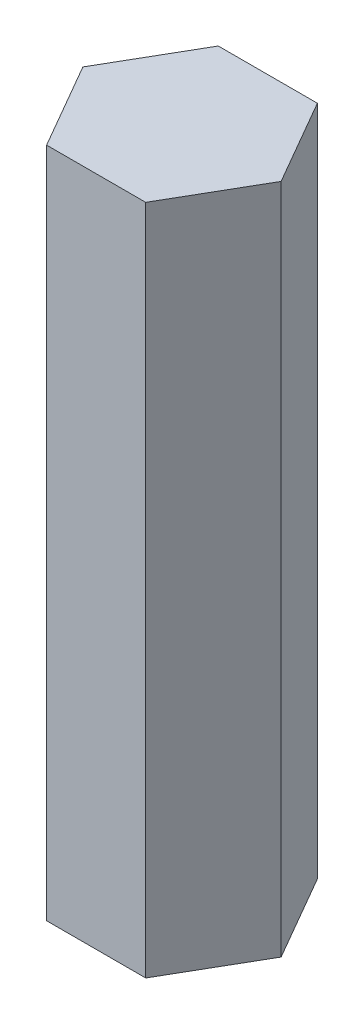
ISO-10303-21;
HEADER;
FILE_DESCRIPTION(('STEP AP214'),'2;1');
FILE_NAME('part.step','',(''),(''),'','','');
FILE_SCHEMA(('AUTOMOTIVE_DESIGN { 1 0 10303 214 1 1 1 1 }'));
ENDSEC;
DATA;
#1=APPLICATION_CONTEXT('core data for automotive mechanical design processes');
#2=APPLICATION_PROTOCOL_DEFINITION('international standard','automotive_design',2000,#1);
#3=PRODUCT_CONTEXT('',#1,'mechanical');
#4=PRODUCT('Part','Part','',(#3));
#5=PRODUCT_RELATED_PRODUCT_CATEGORY('part','',(#4));
#6=PRODUCT_DEFINITION_FORMATION('','',#4);
#7=PRODUCT_DEFINITION_CONTEXT('part definition',#1,'design');
#8=PRODUCT_DEFINITION('design','',#6,#7);
#9=PRODUCT_DEFINITION_SHAPE('','',#8);
#10=(LENGTH_UNIT() NAMED_UNIT(*) SI_UNIT(.MILLI.,.METRE.));
#11=(NAMED_UNIT(*) PLANE_ANGLE_UNIT() SI_UNIT($,.RADIAN.));
#12=(NAMED_UNIT(*) SI_UNIT($,.STERADIAN.) SOLID_ANGLE_UNIT());
#13=UNCERTAINTY_MEASURE_WITH_UNIT(LENGTH_MEASURE(1.E-05),#10,'distance_accuracy_value','');
#14=(GEOMETRIC_REPRESENTATION_CONTEXT(3) GLOBAL_UNCERTAINTY_ASSIGNED_CONTEXT((#13)) GLOBAL_UNIT_ASSIGNED_CONTEXT((#10,
#11,#12)) REPRESENTATION_CONTEXT('',''));
#15=CARTESIAN_POINT('',(0.,0.,0.));
#16=DIRECTION('',(0.,0.,1.));
#17=DIRECTION('',(1.,0.,0.));
#18=AXIS2_PLACEMENT_3D('',#15,#16,#17);
#19=CARTESIAN_POINT('',(1.32790561913614,18.,2.3));
#20=DIRECTION('',(-0.866025403784438,0.,-0.5));
#21=DIRECTION('',(-0.5,0.,0.866025403784438));
#22=AXIS2_PLACEMENT_3D('',#19,#20,#21);
#23=PLANE('',#22);
#24=DIRECTION('',(0.5,0.,-0.866025403784438));
#25=VECTOR('',#24,1.);
#26=CARTESIAN_POINT('',(1.32790561913614,0.,2.3));
#27=LINE('',#26,#25);
#28=CARTESIAN_POINT('',(1.32790561913614,0.,2.3));
#29=VERTEX_POINT('',#28);
#30=CARTESIAN_POINT('',(2.65581123827228,0.,0.));
#31=VERTEX_POINT('',#30);
#32=EDGE_CURVE('E117',#29,#31,#27,.T.);
#33=ORIENTED_EDGE('',*,*,#32,.T.);
#34=DIRECTION('',(0.,-1.,0.));
#35=VECTOR('',#34,1.);
#36=CARTESIAN_POINT('',(2.65581123827228,18.,0.));
#37=LINE('',#36,#35);
#38=CARTESIAN_POINT('',(2.65581123827228,18.,0.));
#39=VERTEX_POINT('',#38);
#40=EDGE_CURVE('E11',#39,#31,#37,.T.);
#41=ORIENTED_EDGE('',*,*,#40,.F.);
#42=DIRECTION('',(0.5,0.,-0.866025403784438));
#43=VECTOR('',#42,1.);
#44=CARTESIAN_POINT('',(1.32790561913614,18.,2.3));
#45=LINE('',#44,#43);
#46=CARTESIAN_POINT('',(1.32790561913614,18.,2.3));
#47=VERTEX_POINT('',#46);
#48=EDGE_CURVE('E127',#47,#39,#45,.T.);
#49=ORIENTED_EDGE('',*,*,#48,.F.);
#50=DIRECTION('',(0.,-1.,0.));
#51=VECTOR('',#50,1.);
#52=CARTESIAN_POINT('',(1.32790561913614,18.,2.3));
#53=LINE('',#52,#51);
#54=EDGE_CURVE('E113',#47,#29,#53,.T.);
#55=ORIENTED_EDGE('',*,*,#54,.T.);
#56=EDGE_LOOP('',(#33,#41,#49,#55));
#57=FACE_BOUND('',#56,.T.);
#58=ADVANCED_FACE('F33',(#57),#23,.F.);
#59=CARTESIAN_POINT('',(2.65581123827228,18.,0.));
#60=DIRECTION('',(-0.866025403784439,0.,0.5));
#61=DIRECTION('',(0.5,0.,0.866025403784439));
#62=AXIS2_PLACEMENT_3D('',#59,#60,#61);
#63=PLANE('',#62);
#64=DIRECTION('',(-0.5,0.,-0.866025403784439));
#65=VECTOR('',#64,1.);
#66=CARTESIAN_POINT('',(2.65581123827228,0.,0.));
#67=LINE('',#66,#65);
#68=CARTESIAN_POINT('',(1.32790561913614,0.,-2.30000000000001));
#69=VERTEX_POINT('',#68);
#70=EDGE_CURVE('E120',#31,#69,#67,.T.);
#71=ORIENTED_EDGE('',*,*,#70,.T.);
#72=DIRECTION('',(0.,-1.,0.));
#73=VECTOR('',#72,1.);
#74=CARTESIAN_POINT('',(1.32790561913614,18.,-2.30000000000001));
#75=LINE('',#74,#73);
#76=CARTESIAN_POINT('',(1.32790561913614,18.,-2.30000000000001));
#77=VERTEX_POINT('',#76);
#78=EDGE_CURVE('E41',#77,#69,#75,.T.);
#79=ORIENTED_EDGE('',*,*,#78,.F.);
#80=DIRECTION('',(-0.5,0.,-0.866025403784439));
#81=VECTOR('',#80,1.);
#82=CARTESIAN_POINT('',(2.65581123827228,18.,0.));
#83=LINE('',#82,#81);
#84=EDGE_CURVE('E86',#39,#77,#83,.T.);
#85=ORIENTED_EDGE('',*,*,#84,.F.);
#86=ORIENTED_EDGE('',*,*,#40,.T.);
#87=EDGE_LOOP('',(#71,#79,#85,#86));
#88=FACE_BOUND('',#87,.T.);
#89=ADVANCED_FACE('F151',(#88),#63,.F.);
#90=CARTESIAN_POINT('',(1.32790561913614,18.,-2.30000000000001));
#91=DIRECTION('',(0.,0.,1.));
#92=DIRECTION('',(1.,0.,0.));
#93=AXIS2_PLACEMENT_3D('',#90,#91,#92);
#94=PLANE('',#93);
#95=DIRECTION('',(-1.,0.,0.));
#96=VECTOR('',#95,1.);
#97=CARTESIAN_POINT('',(1.32790561913614,0.,-2.30000000000001));
#98=LINE('',#97,#96);
#99=CARTESIAN_POINT('',(-1.32790561913614,0.,-2.30000000000001));
#100=VERTEX_POINT('',#99);
#101=EDGE_CURVE('E122',#69,#100,#98,.T.);
#102=ORIENTED_EDGE('',*,*,#101,.T.);
#103=DIRECTION('',(0.,-1.,0.));
#104=VECTOR('',#103,1.);
#105=CARTESIAN_POINT('',(-1.32790561913614,18.,-2.30000000000001));
#106=LINE('',#105,#104);
#107=CARTESIAN_POINT('',(-1.32790561913614,18.,-2.30000000000001));
#108=VERTEX_POINT('',#107);
#109=EDGE_CURVE('E108',#108,#100,#106,.T.);
#110=ORIENTED_EDGE('',*,*,#109,.F.);
#111=DIRECTION('',(-1.,0.,0.));
#112=VECTOR('',#111,1.);
#113=CARTESIAN_POINT('',(1.32790561913614,18.,-2.30000000000001));
#114=LINE('',#113,#112);
#115=EDGE_CURVE('E99',#77,#108,#114,.T.);
#116=ORIENTED_EDGE('',*,*,#115,.F.);
#117=ORIENTED_EDGE('',*,*,#78,.T.);
#118=EDGE_LOOP('',(#102,#110,#116,#117));
#119=FACE_BOUND('',#118,.T.);
#120=ADVANCED_FACE('F133',(#119),#94,.F.);
#121=CARTESIAN_POINT('',(-1.32790561913614,18.,-2.30000000000001));
#122=DIRECTION('',(0.866025403784439,0.,0.5));
#123=DIRECTION('',(0.5,0.,-0.866025403784439));
#124=AXIS2_PLACEMENT_3D('',#121,#122,#123);
#125=PLANE('',#124);
#126=DIRECTION('',(-0.5,0.,0.866025403784439));
#127=VECTOR('',#126,1.);
#128=CARTESIAN_POINT('',(-1.32790561913614,0.,-2.30000000000001));
#129=LINE('',#128,#127);
#130=CARTESIAN_POINT('',(-2.65581123827228,0.,0.));
#131=VERTEX_POINT('',#130);
#132=EDGE_CURVE('E107',#100,#131,#129,.T.);
#133=ORIENTED_EDGE('',*,*,#132,.T.);
#134=DIRECTION('',(0.,-1.,0.));
#135=VECTOR('',#134,1.);
#136=CARTESIAN_POINT('',(-2.65581123827228,18.,0.));
#137=LINE('',#136,#135);
#138=CARTESIAN_POINT('',(-2.65581123827228,18.,0.));
#139=VERTEX_POINT('',#138);
#140=EDGE_CURVE('E104',#139,#131,#137,.T.);
#141=ORIENTED_EDGE('',*,*,#140,.F.);
#142=DIRECTION('',(-0.5,0.,0.866025403784439));
#143=VECTOR('',#142,1.);
#144=CARTESIAN_POINT('',(-1.32790561913614,18.,-2.30000000000001));
#145=LINE('',#144,#143);
#146=EDGE_CURVE('E93',#108,#139,#145,.T.);
#147=ORIENTED_EDGE('',*,*,#146,.F.);
#148=ORIENTED_EDGE('',*,*,#109,.T.);
#149=EDGE_LOOP('',(#133,#141,#147,#148));
#150=FACE_BOUND('',#149,.T.);
#151=ADVANCED_FACE('F105',(#150),#125,.F.);
#152=CARTESIAN_POINT('',(-2.65581123827228,18.,0.));
#153=DIRECTION('',(0.866025403784439,0.,-0.5));
#154=DIRECTION('',(-0.5,0.,-0.866025403784439));
#155=AXIS2_PLACEMENT_3D('',#152,#153,#154);
#156=PLANE('',#155);
#157=DIRECTION('',(0.5,0.,0.866025403784438));
#158=VECTOR('',#157,1.);
#159=CARTESIAN_POINT('',(-2.65581123827228,0.,0.));
#160=LINE('',#159,#158);
#161=CARTESIAN_POINT('',(-1.32790561913614,0.,2.3));
#162=VERTEX_POINT('',#161);
#163=EDGE_CURVE('E72',#131,#162,#160,.T.);
#164=ORIENTED_EDGE('',*,*,#163,.T.);
#165=DIRECTION('',(0.,-1.,0.));
#166=VECTOR('',#165,1.);
#167=CARTESIAN_POINT('',(-1.32790561913614,18.,2.3));
#168=LINE('',#167,#166);
#169=CARTESIAN_POINT('',(-1.32790561913614,18.,2.3));
#170=VERTEX_POINT('',#169);
#171=EDGE_CURVE('E109',#170,#162,#168,.T.);
#172=ORIENTED_EDGE('',*,*,#171,.F.);
#173=DIRECTION('',(0.5,0.,0.866025403784438));
#174=VECTOR('',#173,1.);
#175=CARTESIAN_POINT('',(-2.65581123827228,18.,0.));
#176=LINE('',#175,#174);
#177=EDGE_CURVE('E97',#139,#170,#176,.T.);
#178=ORIENTED_EDGE('',*,*,#177,.F.);
#179=ORIENTED_EDGE('',*,*,#140,.T.);
#180=EDGE_LOOP('',(#164,#172,#178,#179));
#181=FACE_BOUND('',#180,.T.);
#182=ADVANCED_FACE('F111',(#181),#156,.F.);
#183=CARTESIAN_POINT('',(-1.32790561913614,18.,2.3));
#184=DIRECTION('',(0.,0.,-1.));
#185=DIRECTION('',(-1.,0.,0.));
#186=AXIS2_PLACEMENT_3D('',#183,#184,#185);
#187=PLANE('',#186);
#188=DIRECTION('',(1.,0.,0.));
#189=VECTOR('',#188,1.);
#190=CARTESIAN_POINT('',(-1.32790561913614,0.,2.3));
#191=LINE('',#190,#189);
#192=EDGE_CURVE('E78',#162,#29,#191,.T.);
#193=ORIENTED_EDGE('',*,*,#192,.T.);
#194=ORIENTED_EDGE('',*,*,#54,.F.);
#195=DIRECTION('',(1.,0.,0.));
#196=VECTOR('',#195,1.);
#197=CARTESIAN_POINT('',(-1.32790561913614,18.,2.3));
#198=LINE('',#197,#196);
#199=EDGE_CURVE('E49',#170,#47,#198,.T.);
#200=ORIENTED_EDGE('',*,*,#199,.F.);
#201=ORIENTED_EDGE('',*,*,#171,.T.);
#202=EDGE_LOOP('',(#193,#194,#200,#201));
#203=FACE_BOUND('',#202,.T.);
#204=ADVANCED_FACE('F140',(#203),#187,.F.);
#205=CARTESIAN_POINT('',(0.,18.,0.));
#206=DIRECTION('',(0.,1.,0.));
#207=DIRECTION('',(0.,0.,1.));
#208=AXIS2_PLACEMENT_3D('',#205,#206,#207);
#209=PLANE('',#208);
#210=ORIENTED_EDGE('',*,*,#48,.T.);
#211=ORIENTED_EDGE('',*,*,#84,.T.);
#212=ORIENTED_EDGE('',*,*,#115,.T.);
#213=ORIENTED_EDGE('',*,*,#146,.T.);
#214=ORIENTED_EDGE('',*,*,#177,.T.);
#215=ORIENTED_EDGE('',*,*,#199,.T.);
#216=EDGE_LOOP('',(#210,#211,#212,#213,#214,#215));
#217=FACE_BOUND('',#216,.T.);
#218=ADVANCED_FACE('F95',(#217),#209,.T.);
#219=CARTESIAN_POINT('',(0.,0.,0.));
#220=DIRECTION('',(0.,1.,0.));
#221=DIRECTION('',(0.,0.,1.));
#222=AXIS2_PLACEMENT_3D('',#219,#220,#221);
#223=PLANE('',#222);
#224=ORIENTED_EDGE('',*,*,#32,.F.);
#225=ORIENTED_EDGE('',*,*,#192,.F.);
#226=ORIENTED_EDGE('',*,*,#163,.F.);
#227=ORIENTED_EDGE('',*,*,#132,.F.);
#228=ORIENTED_EDGE('',*,*,#101,.F.);
#229=ORIENTED_EDGE('',*,*,#70,.F.);
#230=EDGE_LOOP('',(#224,#225,#226,#227,#228,#229));
#231=FACE_BOUND('',#230,.T.);
#232=ADVANCED_FACE('F136',(#231),#223,.F.);
#233=CLOSED_SHELL('',(#58,#89,#120,#151,#182,#204,#218,#232));
#234=MANIFOLD_SOLID_BREP('B2',#233);
#235=ADVANCED_BREP_SHAPE_REPRESENTATION('',(#18,#234),#14);
#236=SHAPE_DEFINITION_REPRESENTATION(#9,#235);
ENDSEC;
END-ISO-10303-21;
